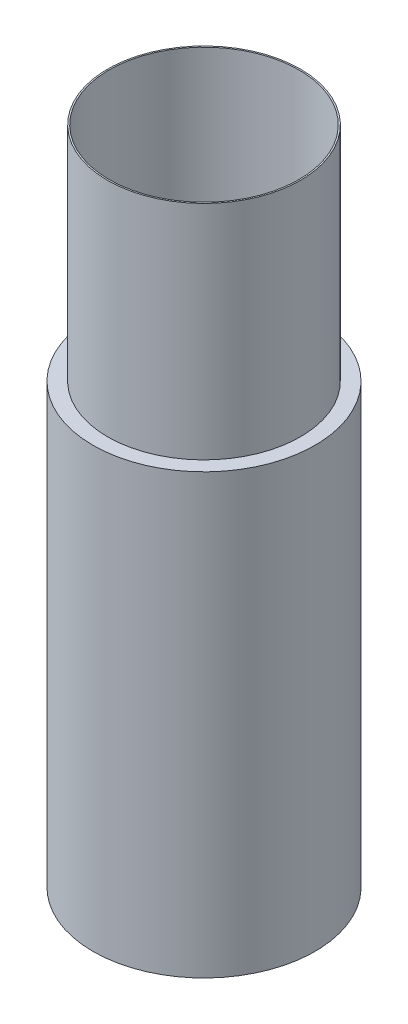
ISO-10303-21;
HEADER;
FILE_DESCRIPTION(('STEP AP214'),'2;1');
FILE_NAME('part.step','',(''),(''),'','','');
FILE_SCHEMA(('AUTOMOTIVE_DESIGN { 1 0 10303 214 1 1 1 1 }'));
ENDSEC;
DATA;
#1=APPLICATION_CONTEXT('core data for automotive mechanical design processes');
#2=APPLICATION_PROTOCOL_DEFINITION('international standard','automotive_design',2000,#1);
#3=PRODUCT_CONTEXT('',#1,'mechanical');
#4=PRODUCT('Part','Part','',(#3));
#5=PRODUCT_RELATED_PRODUCT_CATEGORY('part','',(#4));
#6=PRODUCT_DEFINITION_FORMATION('','',#4);
#7=PRODUCT_DEFINITION_CONTEXT('part definition',#1,'design');
#8=PRODUCT_DEFINITION('design','',#6,#7);
#9=PRODUCT_DEFINITION_SHAPE('','',#8);
#10=(LENGTH_UNIT() NAMED_UNIT(*) SI_UNIT(.MILLI.,.METRE.));
#11=(NAMED_UNIT(*) PLANE_ANGLE_UNIT() SI_UNIT($,.RADIAN.));
#12=(NAMED_UNIT(*) SI_UNIT($,.STERADIAN.) SOLID_ANGLE_UNIT());
#13=UNCERTAINTY_MEASURE_WITH_UNIT(LENGTH_MEASURE(1.E-05),#10,'distance_accuracy_value','');
#14=(GEOMETRIC_REPRESENTATION_CONTEXT(3) GLOBAL_UNCERTAINTY_ASSIGNED_CONTEXT((#13)) GLOBAL_UNIT_ASSIGNED_CONTEXT((#10,
#11,#12)) REPRESENTATION_CONTEXT('',''));
#15=CARTESIAN_POINT('',(0.,0.,0.));
#16=DIRECTION('',(0.,0.,1.));
#17=DIRECTION('',(1.,0.,0.));
#18=AXIS2_PLACEMENT_3D('',#15,#16,#17);
#19=CARTESIAN_POINT('',(0.,204.615384615384,0.));
#20=DIRECTION('',(0.,1.,0.));
#21=DIRECTION('',(0.,0.,1.));
#22=AXIS2_PLACEMENT_3D('',#19,#20,#21);
#23=CYLINDRICAL_SURFACE('',#22,66.);
#24=CARTESIAN_POINT('',(0.,0.,0.));
#25=DIRECTION('',(0.,1.,0.));
#26=DIRECTION('',(0.,0.,1.));
#27=AXIS2_PLACEMENT_3D('',#24,#25,#26);
#28=CIRCLE('',#27,66.);
#29=CARTESIAN_POINT('',(0.,0.,66.));
#30=VERTEX_POINT('',#29);
#31=EDGE_CURVE('E54',#30,#30,#28,.T.);
#32=ORIENTED_EDGE('',*,*,#31,.F.);
#33=EDGE_LOOP('',(#32));
#34=FACE_BOUND('',#33,.T.);
#35=CARTESIAN_POINT('',(0.,148.,0.));
#36=DIRECTION('',(0.,1.,0.));
#37=DIRECTION('',(0.,0.,1.));
#38=AXIS2_PLACEMENT_3D('',#35,#36,#37);
#39=CIRCLE('',#38,66.);
#40=CARTESIAN_POINT('',(0.,148.,66.));
#41=VERTEX_POINT('',#40);
#42=EDGE_CURVE('E10',#41,#41,#39,.F.);
#43=ORIENTED_EDGE('',*,*,#42,.F.);
#44=EDGE_LOOP('',(#43));
#45=FACE_BOUND('',#44,.T.);
#46=ADVANCED_FACE('F34',(#34,#45),#23,.F.);
#47=CARTESIAN_POINT('',(66.,0.,0.));
#48=DIRECTION('',(0.,1.,0.));
#49=DIRECTION('',(0.,0.,1.));
#50=AXIS2_PLACEMENT_3D('',#47,#48,#49);
#51=PLANE('',#50);
#52=CARTESIAN_POINT('',(0.,0.,0.));
#53=DIRECTION('',(0.,1.,0.));
#54=DIRECTION('',(0.,0.,1.));
#55=AXIS2_PLACEMENT_3D('',#52,#53,#54);
#56=CIRCLE('',#55,76.);
#57=CARTESIAN_POINT('',(0.,0.,76.));
#58=VERTEX_POINT('',#57);
#59=EDGE_CURVE('E41',#58,#58,#56,.T.);
#60=ORIENTED_EDGE('',*,*,#59,.F.);
#61=EDGE_LOOP('',(#60));
#62=FACE_BOUND('',#61,.T.);
#63=ORIENTED_EDGE('',*,*,#31,.T.);
#64=EDGE_LOOP('',(#63));
#65=FACE_BOUND('',#64,.T.);
#66=ADVANCED_FACE('F36',(#62,#65),#51,.F.);
#67=CARTESIAN_POINT('',(0.,204.615384615384,0.));
#68=DIRECTION('',(0.,1.,0.));
#69=DIRECTION('',(0.,0.,1.));
#70=AXIS2_PLACEMENT_3D('',#67,#68,#69);
#71=CYLINDRICAL_SURFACE('',#70,76.);
#72=CARTESIAN_POINT('',(0.,300.,0.));
#73=DIRECTION('',(0.,1.,0.));
#74=DIRECTION('',(0.,0.,1.));
#75=AXIS2_PLACEMENT_3D('',#72,#73,#74);
#76=CIRCLE('',#75,76.);
#77=CARTESIAN_POINT('',(0.,300.,76.));
#78=VERTEX_POINT('',#77);
#79=EDGE_CURVE('E45',#78,#78,#76,.T.);
#80=ORIENTED_EDGE('',*,*,#79,.F.);
#81=EDGE_LOOP('',(#80));
#82=FACE_BOUND('',#81,.T.);
#83=ORIENTED_EDGE('',*,*,#59,.T.);
#84=EDGE_LOOP('',(#83));
#85=FACE_BOUND('',#84,.T.);
#86=ADVANCED_FACE('F85',(#82,#85),#71,.T.);
#87=CARTESIAN_POINT('',(76.,300.,0.));
#88=DIRECTION('',(0.,-1.,0.));
#89=DIRECTION('',(0.,0.,-1.));
#90=AXIS2_PLACEMENT_3D('',#87,#88,#89);
#91=PLANE('',#90);
#92=CARTESIAN_POINT('',(0.,300.,0.));
#93=DIRECTION('',(0.,1.,0.));
#94=DIRECTION('',(0.,0.,1.));
#95=AXIS2_PLACEMENT_3D('',#92,#93,#94);
#96=CIRCLE('',#95,66.);
#97=CARTESIAN_POINT('',(0.,300.,66.));
#98=VERTEX_POINT('',#97);
#99=EDGE_CURVE('E49',#98,#98,#96,.T.);
#100=ORIENTED_EDGE('',*,*,#99,.F.);
#101=EDGE_LOOP('',(#100));
#102=FACE_BOUND('',#101,.T.);
#103=ORIENTED_EDGE('',*,*,#79,.T.);
#104=EDGE_LOOP('',(#103));
#105=FACE_BOUND('',#104,.T.);
#106=ADVANCED_FACE('F93',(#102,#105),#91,.F.);
#107=CARTESIAN_POINT('',(0.,148.,0.));
#108=DIRECTION('',(0.,1.,0.));
#109=DIRECTION('',(0.,0.,1.));
#110=AXIS2_PLACEMENT_3D('',#107,#108,#109);
#111=CYLINDRICAL_SURFACE('',#110,66.);
#112=CARTESIAN_POINT('',(0.,452.,0.));
#113=DIRECTION('',(0.,1.,0.));
#114=DIRECTION('',(0.,0.,1.));
#115=AXIS2_PLACEMENT_3D('',#112,#113,#114);
#116=CIRCLE('',#115,66.);
#117=CARTESIAN_POINT('',(0.,452.,66.));
#118=VERTEX_POINT('',#117);
#119=EDGE_CURVE('E60',#118,#118,#116,.T.);
#120=ORIENTED_EDGE('',*,*,#119,.F.);
#121=EDGE_LOOP('',(#120));
#122=FACE_BOUND('',#121,.T.);
#123=ORIENTED_EDGE('',*,*,#99,.T.);
#124=EDGE_LOOP('',(#123));
#125=FACE_BOUND('',#124,.T.);
#126=ADVANCED_FACE('F91',(#122,#125),#111,.T.);
#127=CARTESIAN_POINT('',(0.,148.,0.));
#128=DIRECTION('',(0.,1.,0.));
#129=DIRECTION('',(0.,0.,1.));
#130=AXIS2_PLACEMENT_3D('',#127,#128,#129);
#131=PLANE('',#130);
#132=CARTESIAN_POINT('',(0.,148.,0.));
#133=DIRECTION('',(0.,1.,0.));
#134=DIRECTION('',(0.,0.,1.));
#135=AXIS2_PLACEMENT_3D('',#132,#133,#134);
#136=CIRCLE('',#135,65.);
#137=CARTESIAN_POINT('',(0.,148.,65.));
#138=VERTEX_POINT('',#137);
#139=EDGE_CURVE('E57',#138,#138,#136,.T.);
#140=ORIENTED_EDGE('',*,*,#139,.T.);
#141=EDGE_LOOP('',(#140));
#142=FACE_BOUND('',#141,.T.);
#143=ORIENTED_EDGE('',*,*,#42,.T.);
#144=EDGE_LOOP('',(#143));
#145=FACE_BOUND('',#144,.T.);
#146=ADVANCED_FACE('F76',(#142,#145),#131,.F.);
#147=CARTESIAN_POINT('',(0.,148.,0.));
#148=DIRECTION('',(0.,1.,0.));
#149=DIRECTION('',(0.,0.,1.));
#150=AXIS2_PLACEMENT_3D('',#147,#148,#149);
#151=CYLINDRICAL_SURFACE('',#150,65.);
#152=ORIENTED_EDGE('',*,*,#139,.F.);
#153=EDGE_LOOP('',(#152));
#154=FACE_BOUND('',#153,.T.);
#155=CARTESIAN_POINT('',(0.,452.,0.));
#156=DIRECTION('',(0.,1.,0.));
#157=DIRECTION('',(0.,0.,1.));
#158=AXIS2_PLACEMENT_3D('',#155,#156,#157);
#159=CIRCLE('',#158,65.);
#160=CARTESIAN_POINT('',(0.,452.,65.));
#161=VERTEX_POINT('',#160);
#162=EDGE_CURVE('E63',#161,#161,#159,.T.);
#163=ORIENTED_EDGE('',*,*,#162,.T.);
#164=EDGE_LOOP('',(#163));
#165=FACE_BOUND('',#164,.T.);
#166=ADVANCED_FACE('F67',(#154,#165),#151,.F.);
#167=CARTESIAN_POINT('',(0.,452.,0.));
#168=DIRECTION('',(0.,1.,0.));
#169=DIRECTION('',(0.,0.,1.));
#170=AXIS2_PLACEMENT_3D('',#167,#168,#169);
#171=PLANE('',#170);
#172=ORIENTED_EDGE('',*,*,#119,.T.);
#173=EDGE_LOOP('',(#172));
#174=FACE_BOUND('',#173,.T.);
#175=ORIENTED_EDGE('',*,*,#162,.F.);
#176=EDGE_LOOP('',(#175));
#177=FACE_BOUND('',#176,.T.);
#178=ADVANCED_FACE('F69',(#174,#177),#171,.T.);
#179=CLOSED_SHELL('',(#46,#66,#86,#106,#126,#146,#166,#178));
#180=MANIFOLD_SOLID_BREP('B2',#179);
#181=ADVANCED_BREP_SHAPE_REPRESENTATION('',(#18,#180),#14);
#182=SHAPE_DEFINITION_REPRESENTATION(#9,#181);
ENDSEC;
END-ISO-10303-21;
